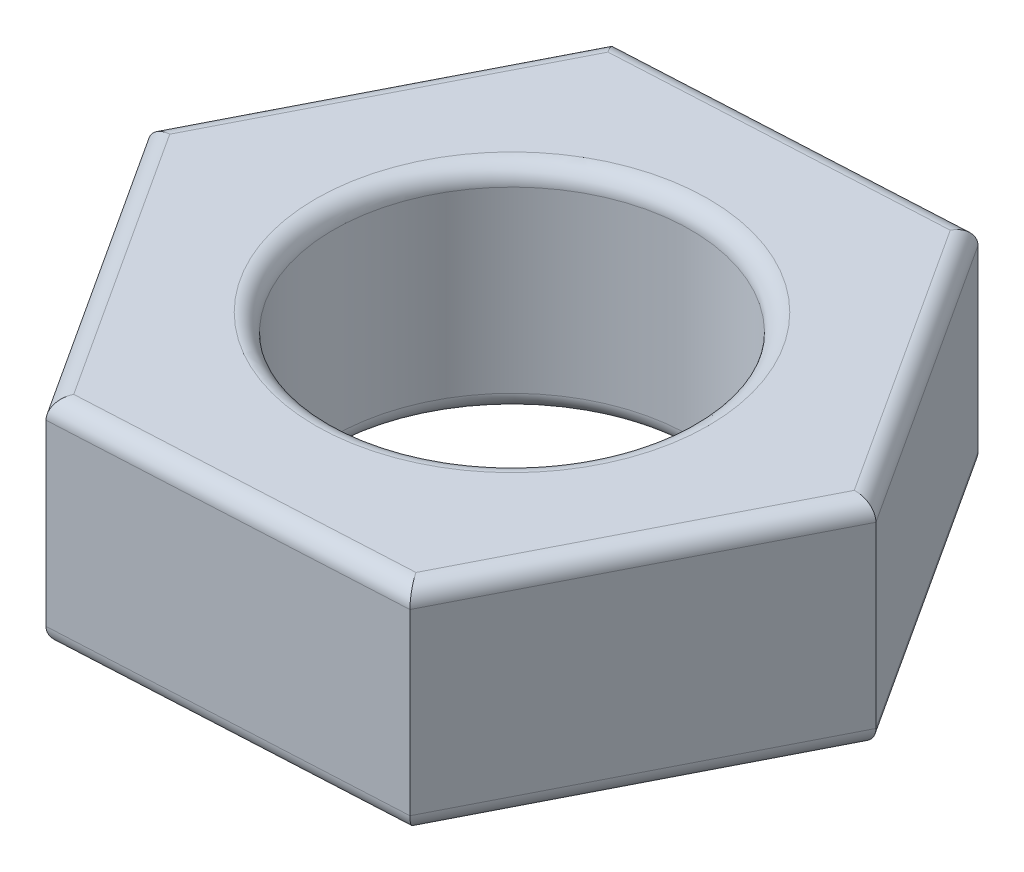
ISO-10303-21;
HEADER;
FILE_DESCRIPTION(('STEP AP214'),'2;1');
FILE_NAME('part.step','',(''),(''),'','','');
FILE_SCHEMA(('AUTOMOTIVE_DESIGN { 1 0 10303 214 1 1 1 1 }'));
ENDSEC;
DATA;
#1=APPLICATION_CONTEXT('core data for automotive mechanical design processes');
#2=APPLICATION_PROTOCOL_DEFINITION('international standard','automotive_design',2000,#1);
#3=PRODUCT_CONTEXT('',#1,'mechanical');
#4=PRODUCT('Part','Part','',(#3));
#5=PRODUCT_RELATED_PRODUCT_CATEGORY('part','',(#4));
#6=PRODUCT_DEFINITION_FORMATION('','',#4);
#7=PRODUCT_DEFINITION_CONTEXT('part definition',#1,'design');
#8=PRODUCT_DEFINITION('design','',#6,#7);
#9=PRODUCT_DEFINITION_SHAPE('','',#8);
#10=(LENGTH_UNIT() NAMED_UNIT(*) SI_UNIT(.MILLI.,.METRE.));
#11=(NAMED_UNIT(*) PLANE_ANGLE_UNIT() SI_UNIT($,.RADIAN.));
#12=(NAMED_UNIT(*) SI_UNIT($,.STERADIAN.) SOLID_ANGLE_UNIT());
#13=UNCERTAINTY_MEASURE_WITH_UNIT(LENGTH_MEASURE(1.E-05),#10,'distance_accuracy_value','');
#14=(GEOMETRIC_REPRESENTATION_CONTEXT(3) GLOBAL_UNCERTAINTY_ASSIGNED_CONTEXT((#13)) GLOBAL_UNIT_ASSIGNED_CONTEXT((#10,
#11,#12)) REPRESENTATION_CONTEXT('',''));
#15=CARTESIAN_POINT('',(0.,0.,0.));
#16=DIRECTION('',(0.,0.,1.));
#17=DIRECTION('',(1.,0.,0.));
#18=AXIS2_PLACEMENT_3D('',#15,#16,#17);
#19=CARTESIAN_POINT('',(0.,6.,0.));
#20=DIRECTION('',(0.,1.,0.));
#21=DIRECTION('',(0.,0.,1.));
#22=AXIS2_PLACEMENT_3D('',#19,#20,#21);
#23=PLANE('',#22);
#24=CARTESIAN_POINT('',(0.,6.,0.));
#25=DIRECTION('',(0.,1.,0.));
#26=DIRECTION('',(0.,0.,1.));
#27=AXIS2_PLACEMENT_3D('',#24,#25,#26);
#28=CIRCLE('',#27,5.5);
#29=CARTESIAN_POINT('',(0.,6.,5.5));
#30=VERTEX_POINT('',#29);
#31=EDGE_CURVE('E11',#30,#30,#28,.F.);
#32=ORIENTED_EDGE('',*,*,#31,.T.);
#33=EDGE_LOOP('',(#32));
#34=FACE_BOUND('',#33,.T.);
#35=DIRECTION('',(-0.45436537546848,0.,0.890815416107842));
#36=VECTOR('',#35,1.);
#37=CARTESIAN_POINT('',(-9.2409967506842,6.,0.730738704219309));
#38=LINE('',#37,#36);
#39=CARTESIAN_POINT('',(-4.96505080973829,6.,-7.65255537647723));
#40=VERTEX_POINT('',#39);
#41=CARTESIAN_POINT('',(-9.10983276476561,6.,0.473582444075242));
#42=VERTEX_POINT('',#41);
#43=EDGE_CURVE('E53',#40,#42,#38,.T.);
#44=ORIENTED_EDGE('',*,*,#43,.T.);
#45=DIRECTION('',(0.544286092697957,0.,0.838899665809679));
#46=VECTOR('',#45,1.);
#47=CARTESIAN_POINT('',(-3.98766009395965,6.,8.36830729449163));
#48=LINE('',#47,#46);
#49=CARTESIAN_POINT('',(-4.14478195502732,6.,8.12613782055248));
#50=VERTEX_POINT('',#49);
#51=EDGE_CURVE('E45',#42,#50,#48,.T.);
#52=ORIENTED_EDGE('',*,*,#51,.T.);
#53=DIRECTION('',(0.998651468166436,0.,-0.0519157502981627));
#54=VECTOR('',#53,1.);
#55=CARTESIAN_POINT('',(5.25333665672455,6.,7.63756859027232));
#56=LINE('',#55,#54);
#57=CARTESIAN_POINT('',(4.96505080973829,6.,7.65255537647723));
#58=VERTEX_POINT('',#57);
#59=EDGE_CURVE('E197',#50,#58,#56,.T.);
#60=ORIENTED_EDGE('',*,*,#59,.T.);
#61=DIRECTION('',(0.45436537546848,0.,-0.890815416107842));
#62=VECTOR('',#61,1.);
#63=CARTESIAN_POINT('',(9.2409967506842,6.,-0.730738704219312));
#64=LINE('',#63,#62);
#65=CARTESIAN_POINT('',(9.10983276476562,6.,-0.473582444075246));
#66=VERTEX_POINT('',#65);
#67=EDGE_CURVE('E199',#58,#66,#64,.T.);
#68=ORIENTED_EDGE('',*,*,#67,.T.);
#69=DIRECTION('',(-0.544286092697956,0.,-0.838899665809679));
#70=VECTOR('',#69,1.);
#71=CARTESIAN_POINT('',(3.98766009395966,6.,-8.36830729449163));
#72=LINE('',#71,#70);
#73=CARTESIAN_POINT('',(4.14478195502733,6.,-8.12613782055247));
#74=VERTEX_POINT('',#73);
#75=EDGE_CURVE('E201',#66,#74,#72,.T.);
#76=ORIENTED_EDGE('',*,*,#75,.T.);
#77=DIRECTION('',(-0.998651468166436,0.,0.0519157502981625));
#78=VECTOR('',#77,1.);
#79=CARTESIAN_POINT('',(-5.25333665672454,6.,-7.63756859027232));
#80=LINE('',#79,#78);
#81=EDGE_CURVE('E58',#74,#40,#80,.T.);
#82=ORIENTED_EDGE('',*,*,#81,.T.);
#83=EDGE_LOOP('',(#44,#52,#60,#68,#76,#82));
#84=FACE_BOUND('',#83,.T.);
#85=ADVANCED_FACE('F36',(#34,#84),#23,.T.);
#86=CARTESIAN_POINT('',(0.,0.,0.));
#87=DIRECTION('',(0.,1.,0.));
#88=DIRECTION('',(0.,0.,1.));
#89=AXIS2_PLACEMENT_3D('',#86,#87,#88);
#90=PLANE('',#89);
#91=CARTESIAN_POINT('',(0.,0.,0.));
#92=DIRECTION('',(0.,1.,0.));
#93=DIRECTION('',(0.,0.,1.));
#94=AXIS2_PLACEMENT_3D('',#91,#92,#93);
#95=CIRCLE('',#94,5.5);
#96=CARTESIAN_POINT('',(0.,0.,5.5));
#97=VERTEX_POINT('',#96);
#98=EDGE_CURVE('E154',#97,#97,#95,.T.);
#99=ORIENTED_EDGE('',*,*,#98,.T.);
#100=EDGE_LOOP('',(#99));
#101=FACE_BOUND('',#100,.T.);
#102=DIRECTION('',(-0.544286092697956,0.,-0.838899665809679));
#103=VECTOR('',#102,1.);
#104=CARTESIAN_POINT('',(6.62730735989647,0.,-4.29986013231386));
#105=LINE('',#104,#103);
#106=CARTESIAN_POINT('',(4.14478195502733,0.,-8.12613782055247));
#107=VERTEX_POINT('',#106);
#108=CARTESIAN_POINT('',(9.10983276476562,0.,-0.473582444075246));
#109=VERTEX_POINT('',#108);
#110=EDGE_CURVE('E153',#107,#109,#105,.F.);
#111=ORIENTED_EDGE('',*,*,#110,.T.);
#112=DIRECTION('',(0.45436537546848,0.,-0.890815416107842));
#113=VECTOR('',#112,1.);
#114=CARTESIAN_POINT('',(7.03744178725195,0.,3.58948646620099));
#115=LINE('',#114,#113);
#116=CARTESIAN_POINT('',(4.96505080973829,0.,7.65255537647723));
#117=VERTEX_POINT('',#116);
#118=EDGE_CURVE('E132',#109,#117,#115,.F.);
#119=ORIENTED_EDGE('',*,*,#118,.T.);
#120=DIRECTION('',(0.998651468166436,0.,-0.0519157502981627));
#121=VECTOR('',#120,1.);
#122=CARTESIAN_POINT('',(0.410134427355486,0.,7.88934659851485));
#123=LINE('',#122,#121);
#124=CARTESIAN_POINT('',(-4.14478195502732,0.,8.12613782055248));
#125=VERTEX_POINT('',#124);
#126=EDGE_CURVE('E142',#117,#125,#123,.F.);
#127=ORIENTED_EDGE('',*,*,#126,.T.);
#128=DIRECTION('',(0.544286092697957,0.,0.838899665809679));
#129=VECTOR('',#128,1.);
#130=CARTESIAN_POINT('',(-6.62730735989647,0.,4.29986013231386));
#131=LINE('',#130,#129);
#132=CARTESIAN_POINT('',(-9.10983276476561,0.,0.473582444075244));
#133=VERTEX_POINT('',#132);
#134=EDGE_CURVE('E148',#125,#133,#131,.F.);
#135=ORIENTED_EDGE('',*,*,#134,.T.);
#136=DIRECTION('',(-0.45436537546848,0.,0.890815416107842));
#137=VECTOR('',#136,1.);
#138=CARTESIAN_POINT('',(-7.03744178725195,0.,-3.58948646620099));
#139=LINE('',#138,#137);
#140=CARTESIAN_POINT('',(-4.96505080973829,0.,-7.65255537647723));
#141=VERTEX_POINT('',#140);
#142=EDGE_CURVE('E262',#133,#141,#139,.F.);
#143=ORIENTED_EDGE('',*,*,#142,.T.);
#144=DIRECTION('',(-0.998651468166436,0.,0.0519157502981625));
#145=VECTOR('',#144,1.);
#146=CARTESIAN_POINT('',(-0.410134427355484,0.,-7.88934659851485));
#147=LINE('',#146,#145);
#148=EDGE_CURVE('E159',#141,#107,#147,.F.);
#149=ORIENTED_EDGE('',*,*,#148,.T.);
#150=EDGE_LOOP('',(#111,#119,#127,#135,#143,#149));
#151=FACE_BOUND('',#150,.T.);
#152=ADVANCED_FACE('F151',(#101,#151),#90,.F.);
#153=CARTESIAN_POINT('',(-4.40710992686449,6.,8.64045034084061));
#154=DIRECTION('',(-0.0519157502981627,0.,-0.998651468166436));
#155=DIRECTION('',(-0.998651468166436,0.,0.0519157502981627));
#156=AXIS2_PLACEMENT_3D('',#153,#154,#155);
#157=PLANE('',#156);
#158=DIRECTION('',(0.,-1.,0.));
#159=VECTOR('',#158,1.);
#160=CARTESIAN_POINT('',(-4.40710992686449,6.,8.64045034084061));
#161=LINE('',#160,#159);
#162=CARTESIAN_POINT('',(-4.40710992686449,5.5,8.64045034084061));
#163=VERTEX_POINT('',#162);
#164=CARTESIAN_POINT('',(-4.40710992686449,0.5,8.64045034084061));
#165=VERTEX_POINT('',#164);
#166=EDGE_CURVE('E218',#163,#165,#161,.T.);
#167=ORIENTED_EDGE('',*,*,#166,.T.);
#168=DIRECTION('',(0.998651468166436,0.,-0.0519157502981627));
#169=VECTOR('',#168,1.);
#170=CARTESIAN_POINT('',(-4.40710992686449,0.5,8.64045034084061));
#171=LINE('',#170,#169);
#172=CARTESIAN_POINT('',(5.27929453187363,0.5,8.13689432435554));
#173=VERTEX_POINT('',#172);
#174=EDGE_CURVE('E195',#165,#173,#171,.T.);
#175=ORIENTED_EDGE('',*,*,#174,.T.);
#176=DIRECTION('',(0.,-1.,0.));
#177=VECTOR('',#176,1.);
#178=CARTESIAN_POINT('',(5.27929453187363,6.,8.13689432435554));
#179=LINE('',#178,#177);
#180=CARTESIAN_POINT('',(5.27929453187363,5.5,8.13689432435554));
#181=VERTEX_POINT('',#180);
#182=EDGE_CURVE('E149',#181,#173,#179,.T.);
#183=ORIENTED_EDGE('',*,*,#182,.F.);
#184=DIRECTION('',(0.998651468166436,0.,-0.0519157502981627));
#185=VECTOR('',#184,1.);
#186=CARTESIAN_POINT('',(-4.40710992686449,5.5,8.64045034084061));
#187=LINE('',#186,#185);
#188=EDGE_CURVE('E193',#181,#163,#187,.F.);
#189=ORIENTED_EDGE('',*,*,#188,.T.);
#190=EDGE_LOOP('',(#167,#175,#183,#189));
#191=FACE_BOUND('',#190,.T.);
#192=ADVANCED_FACE('F286',(#191),#157,.F.);
#193=CARTESIAN_POINT('',(5.27929453187363,6.,8.13689432435554));
#194=DIRECTION('',(-0.890815416107842,0.,-0.45436537546848));
#195=DIRECTION('',(-0.45436537546848,0.,0.890815416107842));
#196=AXIS2_PLACEMENT_3D('',#193,#194,#195);
#197=PLANE('',#196);
#198=ORIENTED_EDGE('',*,*,#182,.T.);
#199=DIRECTION('',(0.45436537546848,0.,-0.890815416107842));
#200=VECTOR('',#199,1.);
#201=CARTESIAN_POINT('',(5.27929453187363,0.5,8.13689432435554));
#202=LINE('',#201,#200);
#203=CARTESIAN_POINT('',(9.68640445873812,0.5,-0.503556016485071));
#204=VERTEX_POINT('',#203);
#205=EDGE_CURVE('E135',#173,#204,#202,.T.);
#206=ORIENTED_EDGE('',*,*,#205,.T.);
#207=DIRECTION('',(0.,-1.,0.));
#208=VECTOR('',#207,1.);
#209=CARTESIAN_POINT('',(9.68640445873812,6.,-0.503556016485071));
#210=LINE('',#209,#208);
#211=CARTESIAN_POINT('',(9.68640445873812,5.5,-0.503556016485071));
#212=VERTEX_POINT('',#211);
#213=EDGE_CURVE('E247',#212,#204,#210,.T.);
#214=ORIENTED_EDGE('',*,*,#213,.F.);
#215=DIRECTION('',(0.45436537546848,0.,-0.890815416107842));
#216=VECTOR('',#215,1.);
#217=CARTESIAN_POINT('',(5.27929453187363,5.5,8.13689432435554));
#218=LINE('',#217,#216);
#219=EDGE_CURVE('E168',#212,#181,#218,.F.);
#220=ORIENTED_EDGE('',*,*,#219,.T.);
#221=EDGE_LOOP('',(#198,#206,#214,#220));
#222=FACE_BOUND('',#221,.T.);
#223=ADVANCED_FACE('F252',(#222),#197,.F.);
#224=CARTESIAN_POINT('',(9.68640445873812,6.,-0.503556016485071));
#225=DIRECTION('',(-0.838899665809679,0.,0.544286092697956));
#226=DIRECTION('',(0.544286092697956,0.,0.838899665809679));
#227=AXIS2_PLACEMENT_3D('',#224,#225,#226);
#228=PLANE('',#227);
#229=ORIENTED_EDGE('',*,*,#213,.T.);
#230=DIRECTION('',(-0.544286092697956,0.,-0.838899665809679));
#231=VECTOR('',#230,1.);
#232=CARTESIAN_POINT('',(9.68640445873812,0.5,-0.503556016485071));
#233=LINE('',#232,#231);
#234=CARTESIAN_POINT('',(4.4071099268645,0.5,-8.64045034084061));
#235=VERTEX_POINT('',#234);
#236=EDGE_CURVE('E175',#204,#235,#233,.T.);
#237=ORIENTED_EDGE('',*,*,#236,.T.);
#238=DIRECTION('',(0.,-1.,0.));
#239=VECTOR('',#238,1.);
#240=CARTESIAN_POINT('',(4.4071099268645,6.,-8.64045034084061));
#241=LINE('',#240,#239);
#242=CARTESIAN_POINT('',(4.4071099268645,5.5,-8.64045034084061));
#243=VERTEX_POINT('',#242);
#244=EDGE_CURVE('E249',#243,#235,#241,.T.);
#245=ORIENTED_EDGE('',*,*,#244,.F.);
#246=DIRECTION('',(-0.544286092697956,0.,-0.838899665809679));
#247=VECTOR('',#246,1.);
#248=CARTESIAN_POINT('',(9.68640445873812,5.5,-0.503556016485071));
#249=LINE('',#248,#247);
#250=EDGE_CURVE('E172',#243,#212,#249,.F.);
#251=ORIENTED_EDGE('',*,*,#250,.T.);
#252=EDGE_LOOP('',(#229,#237,#245,#251));
#253=FACE_BOUND('',#252,.T.);
#254=ADVANCED_FACE('F246',(#253),#228,.F.);
#255=CARTESIAN_POINT('',(4.4071099268645,6.,-8.64045034084061));
#256=DIRECTION('',(0.0519157502981625,0.,0.998651468166436));
#257=DIRECTION('',(0.998651468166436,0.,-0.0519157502981625));
#258=AXIS2_PLACEMENT_3D('',#255,#256,#257);
#259=PLANE('',#258);
#260=ORIENTED_EDGE('',*,*,#244,.T.);
#261=DIRECTION('',(-0.998651468166436,0.,0.0519157502981625));
#262=VECTOR('',#261,1.);
#263=CARTESIAN_POINT('',(4.4071099268645,0.5,-8.64045034084061));
#264=LINE('',#263,#262);
#265=CARTESIAN_POINT('',(-5.27929453187363,0.5,-8.13689432435554));
#266=VERTEX_POINT('',#265);
#267=EDGE_CURVE('E179',#235,#266,#264,.T.);
#268=ORIENTED_EDGE('',*,*,#267,.T.);
#269=DIRECTION('',(0.,-1.,0.));
#270=VECTOR('',#269,1.);
#271=CARTESIAN_POINT('',(-5.27929453187363,6.,-8.13689432435554));
#272=LINE('',#271,#270);
#273=CARTESIAN_POINT('',(-5.27929453187363,5.5,-8.13689432435554));
#274=VERTEX_POINT('',#273);
#275=EDGE_CURVE('E256',#274,#266,#272,.T.);
#276=ORIENTED_EDGE('',*,*,#275,.F.);
#277=DIRECTION('',(-0.998651468166436,0.,0.0519157502981625));
#278=VECTOR('',#277,1.);
#279=CARTESIAN_POINT('',(4.4071099268645,5.5,-8.64045034084061));
#280=LINE('',#279,#278);
#281=EDGE_CURVE('E177',#274,#243,#280,.F.);
#282=ORIENTED_EDGE('',*,*,#281,.T.);
#283=EDGE_LOOP('',(#260,#268,#276,#282));
#284=FACE_BOUND('',#283,.T.);
#285=ADVANCED_FACE('F274',(#284),#259,.F.);
#286=CARTESIAN_POINT('',(-5.27929453187363,6.,-8.13689432435554));
#287=DIRECTION('',(0.890815416107842,0.,0.45436537546848));
#288=DIRECTION('',(0.45436537546848,0.,-0.890815416107842));
#289=AXIS2_PLACEMENT_3D('',#286,#287,#288);
#290=PLANE('',#289);
#291=ORIENTED_EDGE('',*,*,#275,.T.);
#292=DIRECTION('',(-0.45436537546848,0.,0.890815416107842));
#293=VECTOR('',#292,1.);
#294=CARTESIAN_POINT('',(-5.27929453187363,0.5,-8.13689432435554));
#295=LINE('',#294,#293);
#296=CARTESIAN_POINT('',(-9.68640445873812,0.5,0.503556016485069));
#297=VERTEX_POINT('',#296);
#298=EDGE_CURVE('E184',#266,#297,#295,.T.);
#299=ORIENTED_EDGE('',*,*,#298,.T.);
#300=DIRECTION('',(0.,-1.,0.));
#301=VECTOR('',#300,1.);
#302=CARTESIAN_POINT('',(-9.68640445873812,6.,0.503556016485069));
#303=LINE('',#302,#301);
#304=CARTESIAN_POINT('',(-9.68640445873812,5.5,0.503556016485069));
#305=VERTEX_POINT('',#304);
#306=EDGE_CURVE('E279',#305,#297,#303,.T.);
#307=ORIENTED_EDGE('',*,*,#306,.F.);
#308=DIRECTION('',(-0.45436537546848,0.,0.890815416107842));
#309=VECTOR('',#308,1.);
#310=CARTESIAN_POINT('',(-5.27929453187363,5.5,-8.13689432435554));
#311=LINE('',#310,#309);
#312=EDGE_CURVE('E181',#305,#274,#311,.F.);
#313=ORIENTED_EDGE('',*,*,#312,.T.);
#314=EDGE_LOOP('',(#291,#299,#307,#313));
#315=FACE_BOUND('',#314,.T.);
#316=ADVANCED_FACE('F297',(#315),#290,.F.);
#317=CARTESIAN_POINT('',(-9.68640445873812,6.,0.503556016485069));
#318=DIRECTION('',(0.838899665809679,0.,-0.544286092697956));
#319=DIRECTION('',(-0.544286092697957,0.,-0.838899665809679));
#320=AXIS2_PLACEMENT_3D('',#317,#318,#319);
#321=PLANE('',#320);
#322=ORIENTED_EDGE('',*,*,#306,.T.);
#323=DIRECTION('',(0.544286092697957,0.,0.838899665809679));
#324=VECTOR('',#323,1.);
#325=CARTESIAN_POINT('',(-9.68640445873812,0.5,0.503556016485069));
#326=LINE('',#325,#324);
#327=EDGE_CURVE('E190',#297,#165,#326,.T.);
#328=ORIENTED_EDGE('',*,*,#327,.T.);
#329=ORIENTED_EDGE('',*,*,#166,.F.);
#330=DIRECTION('',(0.544286092697957,0.,0.838899665809679));
#331=VECTOR('',#330,1.);
#332=CARTESIAN_POINT('',(-9.68640445873812,5.5,0.503556016485069));
#333=LINE('',#332,#331);
#334=EDGE_CURVE('E186',#163,#305,#333,.F.);
#335=ORIENTED_EDGE('',*,*,#334,.T.);
#336=EDGE_LOOP('',(#322,#328,#329,#335));
#337=FACE_BOUND('',#336,.T.);
#338=ADVANCED_FACE('F298',(#337),#321,.F.);
#339=CARTESIAN_POINT('',(0.,6.,0.));
#340=DIRECTION('',(0.,-1.,0.));
#341=DIRECTION('',(0.,0.,-1.));
#342=AXIS2_PLACEMENT_3D('',#339,#340,#341);
#343=CYLINDRICAL_SURFACE('',#342,5.);
#344=CARTESIAN_POINT('',(0.,0.5,0.));
#345=DIRECTION('',(0.,1.,0.));
#346=DIRECTION('',(0.,0.,1.));
#347=AXIS2_PLACEMENT_3D('',#344,#345,#346);
#348=CIRCLE('',#347,5.);
#349=CARTESIAN_POINT('',(0.,0.5,5.));
#350=VERTEX_POINT('',#349);
#351=EDGE_CURVE('E165',#350,#350,#348,.F.);
#352=ORIENTED_EDGE('',*,*,#351,.T.);
#353=EDGE_LOOP('',(#352));
#354=FACE_BOUND('',#353,.T.);
#355=CARTESIAN_POINT('',(0.,5.5,0.));
#356=DIRECTION('',(0.,1.,0.));
#357=DIRECTION('',(0.,0.,1.));
#358=AXIS2_PLACEMENT_3D('',#355,#356,#357);
#359=CIRCLE('',#358,5.);
#360=CARTESIAN_POINT('',(0.,5.5,5.));
#361=VERTEX_POINT('',#360);
#362=EDGE_CURVE('E157',#361,#361,#359,.T.);
#363=ORIENTED_EDGE('',*,*,#362,.T.);
#364=EDGE_LOOP('',(#363));
#365=FACE_BOUND('',#364,.T.);
#366=ADVANCED_FACE('F317',(#354,#365),#343,.F.);
#367=CARTESIAN_POINT('',(0.,0.5,0.));
#368=DIRECTION('',(0.,1.,0.));
#369=DIRECTION('',(0.,0.,1.));
#370=AXIS2_PLACEMENT_3D('',#367,#368,#369);
#371=TOROIDAL_SURFACE('',#370,5.5,0.5);
#372=ORIENTED_EDGE('',*,*,#351,.F.);
#373=EDGE_LOOP('',(#372));
#374=FACE_BOUND('',#373,.T.);
#375=ORIENTED_EDGE('',*,*,#98,.F.);
#376=EDGE_LOOP('',(#375));
#377=FACE_BOUND('',#376,.T.);
#378=ADVANCED_FACE('F331',(#374,#377),#371,.T.);
#379=CARTESIAN_POINT('',(-4.8338868238197,0.5,-7.9097116366213));
#380=DIRECTION('',(-0.45436537546848,0.,0.890815416107842));
#381=DIRECTION('',(0.890815416107842,0.,0.45436537546848));
#382=AXIS2_PLACEMENT_3D('',#379,#380,#381);
#383=CYLINDRICAL_SURFACE('',#382,0.5);
#384=CARTESIAN_POINT('',(-4.96505080973829,0.5,-7.65255537647723));
#385=DIRECTION('',(-0.838899665809679,0.,0.544286092697957));
#386=DIRECTION('',(0.544286092697957,0.,0.838899665809679));
#387=AXIS2_PLACEMENT_3D('',#384,#385,#386);
#388=ELLIPSE('',#387,0.577350269189626,0.5);
#389=EDGE_CURVE('E212',#141,#266,#388,.F.);
#390=ORIENTED_EDGE('',*,*,#389,.F.);
#391=ORIENTED_EDGE('',*,*,#142,.F.);
#392=CARTESIAN_POINT('',(-9.10983276476561,0.5,0.473582444075246));
#393=DIRECTION('',(0.0519157502981626,0.,0.998651468166436));
#394=DIRECTION('',(0.998651468166436,0.,-0.0519157502981628));
#395=AXIS2_PLACEMENT_3D('',#392,#393,#394);
#396=ELLIPSE('',#395,0.577350269189626,0.5);
#397=EDGE_CURVE('E215',#297,#133,#396,.T.);
#398=ORIENTED_EDGE('',*,*,#397,.F.);
#399=ORIENTED_EDGE('',*,*,#298,.F.);
#400=EDGE_LOOP('',(#390,#391,#398,#399));
#401=FACE_BOUND('',#400,.T.);
#402=ADVANCED_FACE('F295',(#401),#383,.T.);
#403=CARTESIAN_POINT('',(-9.26695462583328,0.5,0.231412970136091));
#404=DIRECTION('',(0.544286092697957,0.,0.838899665809679));
#405=DIRECTION('',(0.838899665809679,0.,-0.544286092697957));
#406=AXIS2_PLACEMENT_3D('',#403,#404,#405);
#407=CYLINDRICAL_SURFACE('',#406,0.5);
#408=ORIENTED_EDGE('',*,*,#397,.T.);
#409=ORIENTED_EDGE('',*,*,#134,.F.);
#410=CARTESIAN_POINT('',(-4.14478195502732,0.5,8.12613782055248));
#411=DIRECTION('',(0.890815416107842,0.,0.45436537546848));
#412=DIRECTION('',(0.45436537546848,0.,-0.890815416107842));
#413=AXIS2_PLACEMENT_3D('',#410,#411,#412);
#414=ELLIPSE('',#413,0.577350269189626,0.5);
#415=EDGE_CURVE('E145',#165,#125,#414,.T.);
#416=ORIENTED_EDGE('',*,*,#415,.F.);
#417=ORIENTED_EDGE('',*,*,#327,.F.);
#418=EDGE_LOOP('',(#408,#409,#416,#417));
#419=FACE_BOUND('',#418,.T.);
#420=ADVANCED_FACE('F292',(#419),#407,.T.);
#421=CARTESIAN_POINT('',(4.43306780201358,0.5,-8.14112460675739));
#422=DIRECTION('',(-0.998651468166436,0.,0.0519157502981625));
#423=DIRECTION('',(0.0519157502981625,0.,0.998651468166436));
#424=AXIS2_PLACEMENT_3D('',#421,#422,#423);
#425=CYLINDRICAL_SURFACE('',#424,0.5);
#426=ORIENTED_EDGE('',*,*,#389,.T.);
#427=ORIENTED_EDGE('',*,*,#267,.F.);
#428=CARTESIAN_POINT('',(4.14478195502733,0.5,-8.12613782055248));
#429=DIRECTION('',(-0.890815416107842,0.,-0.45436537546848));
#430=DIRECTION('',(-0.45436537546848,0.,0.890815416107842));
#431=AXIS2_PLACEMENT_3D('',#428,#429,#430);
#432=ELLIPSE('',#431,0.577350269189626,0.5);
#433=EDGE_CURVE('E138',#107,#235,#432,.F.);
#434=ORIENTED_EDGE('',*,*,#433,.F.);
#435=ORIENTED_EDGE('',*,*,#148,.F.);
#436=EDGE_LOOP('',(#426,#427,#434,#435));
#437=FACE_BOUND('',#436,.T.);
#438=ADVANCED_FACE('F269',(#437),#425,.T.);
#439=CARTESIAN_POINT('',(-4.43306780201357,0.5,8.14112460675739));
#440=DIRECTION('',(0.998651468166436,0.,-0.0519157502981627));
#441=DIRECTION('',(-0.0519157502981627,0.,-0.998651468166436));
#442=AXIS2_PLACEMENT_3D('',#439,#440,#441);
#443=CYLINDRICAL_SURFACE('',#442,0.5);
#444=ORIENTED_EDGE('',*,*,#415,.T.);
#445=ORIENTED_EDGE('',*,*,#126,.F.);
#446=CARTESIAN_POINT('',(4.96505080973829,0.5,7.65255537647723));
#447=DIRECTION('',(0.838899665809679,0.,-0.544286092697957));
#448=DIRECTION('',(0.544286092697957,0.,0.838899665809679));
#449=AXIS2_PLACEMENT_3D('',#446,#447,#448);
#450=ELLIPSE('',#449,0.577350269189626,0.5);
#451=EDGE_CURVE('E128',#173,#117,#450,.T.);
#452=ORIENTED_EDGE('',*,*,#451,.F.);
#453=ORIENTED_EDGE('',*,*,#174,.F.);
#454=EDGE_LOOP('',(#444,#445,#452,#453));
#455=FACE_BOUND('',#454,.T.);
#456=ADVANCED_FACE('F143',(#455),#443,.T.);
#457=CARTESIAN_POINT('',(9.26695462583328,0.5,-0.231412970136093));
#458=DIRECTION('',(-0.544286092697956,0.,-0.838899665809679));
#459=DIRECTION('',(-0.838899665809679,0.,0.544286092697956));
#460=AXIS2_PLACEMENT_3D('',#457,#458,#459);
#461=CYLINDRICAL_SURFACE('',#460,0.5);
#462=ORIENTED_EDGE('',*,*,#433,.T.);
#463=ORIENTED_EDGE('',*,*,#236,.F.);
#464=CARTESIAN_POINT('',(9.10983276476562,0.5,-0.473582444075248));
#465=DIRECTION('',(-0.0519157502981625,0.,-0.998651468166436));
#466=DIRECTION('',(-0.998651468166436,0.,0.0519157502981627));
#467=AXIS2_PLACEMENT_3D('',#464,#465,#466);
#468=ELLIPSE('',#467,0.577350269189626,0.5);
#469=EDGE_CURVE('E139',#109,#204,#468,.F.);
#470=ORIENTED_EDGE('',*,*,#469,.F.);
#471=ORIENTED_EDGE('',*,*,#110,.F.);
#472=EDGE_LOOP('',(#462,#463,#470,#471));
#473=FACE_BOUND('',#472,.T.);
#474=ADVANCED_FACE('F272',(#473),#461,.T.);
#475=CARTESIAN_POINT('',(4.83388682381971,0.5,7.9097116366213));
#476=DIRECTION('',(0.45436537546848,0.,-0.890815416107842));
#477=DIRECTION('',(-0.890815416107842,0.,-0.45436537546848));
#478=AXIS2_PLACEMENT_3D('',#475,#476,#477);
#479=CYLINDRICAL_SURFACE('',#478,0.5);
#480=ORIENTED_EDGE('',*,*,#451,.T.);
#481=ORIENTED_EDGE('',*,*,#118,.F.);
#482=ORIENTED_EDGE('',*,*,#469,.T.);
#483=ORIENTED_EDGE('',*,*,#205,.F.);
#484=EDGE_LOOP('',(#480,#481,#482,#483));
#485=FACE_BOUND('',#484,.T.);
#486=ADVANCED_FACE('F130',(#485),#479,.T.);
#487=CARTESIAN_POINT('',(0.,5.5,0.));
#488=DIRECTION('',(0.,1.,0.));
#489=DIRECTION('',(0.,0.,1.));
#490=AXIS2_PLACEMENT_3D('',#487,#488,#489);
#491=TOROIDAL_SURFACE('',#490,5.5,0.5);
#492=ORIENTED_EDGE('',*,*,#31,.F.);
#493=EDGE_LOOP('',(#492));
#494=FACE_BOUND('',#493,.T.);
#495=ORIENTED_EDGE('',*,*,#362,.F.);
#496=EDGE_LOOP('',(#495));
#497=FACE_BOUND('',#496,.T.);
#498=ADVANCED_FACE('F337',(#494,#497),#491,.T.);
#499=CARTESIAN_POINT('',(6.62730735989647,5.5,-4.29986013231386));
#500=DIRECTION('',(0.544286092697956,0.,0.838899665809679));
#501=DIRECTION('',(0.838899665809679,0.,-0.544286092697956));
#502=AXIS2_PLACEMENT_3D('',#499,#500,#501);
#503=CYLINDRICAL_SURFACE('',#502,0.5);
#504=CARTESIAN_POINT('',(9.10983276476562,5.5,-0.473582444075246));
#505=DIRECTION('',(0.0519157502981625,0.,0.998651468166436));
#506=DIRECTION('',(-0.998651468166436,0.,0.0519157502981627));
#507=AXIS2_PLACEMENT_3D('',#504,#505,#506);
#508=ELLIPSE('',#507,0.577350269189626,0.5);
#509=EDGE_CURVE('E228',#212,#66,#508,.T.);
#510=ORIENTED_EDGE('',*,*,#509,.F.);
#511=ORIENTED_EDGE('',*,*,#250,.F.);
#512=CARTESIAN_POINT('',(4.14478195502733,5.5,-8.12613782055247));
#513=DIRECTION('',(0.890815416107842,0.,0.45436537546848));
#514=DIRECTION('',(-0.45436537546848,0.,0.890815416107842));
#515=AXIS2_PLACEMENT_3D('',#512,#513,#514);
#516=ELLIPSE('',#515,0.577350269189626,0.5);
#517=EDGE_CURVE('E40',#74,#243,#516,.F.);
#518=ORIENTED_EDGE('',*,*,#517,.F.);
#519=ORIENTED_EDGE('',*,*,#75,.F.);
#520=EDGE_LOOP('',(#510,#511,#518,#519));
#521=FACE_BOUND('',#520,.T.);
#522=ADVANCED_FACE('F38',(#521),#503,.T.);
#523=CARTESIAN_POINT('',(-0.410134427355484,5.5,-7.88934659851485));
#524=DIRECTION('',(0.998651468166436,0.,-0.0519157502981625));
#525=DIRECTION('',(-0.0519157502981625,0.,-0.998651468166436));
#526=AXIS2_PLACEMENT_3D('',#523,#524,#525);
#527=CYLINDRICAL_SURFACE('',#526,0.5);
#528=ORIENTED_EDGE('',*,*,#517,.T.);
#529=ORIENTED_EDGE('',*,*,#281,.F.);
#530=CARTESIAN_POINT('',(-4.96505080973829,5.5,-7.65255537647723));
#531=DIRECTION('',(0.838899665809679,0.,-0.544286092697957));
#532=DIRECTION('',(0.544286092697957,0.,0.838899665809679));
#533=AXIS2_PLACEMENT_3D('',#530,#531,#532);
#534=ELLIPSE('',#533,0.577350269189626,0.5);
#535=EDGE_CURVE('E226',#40,#274,#534,.F.);
#536=ORIENTED_EDGE('',*,*,#535,.F.);
#537=ORIENTED_EDGE('',*,*,#81,.F.);
#538=EDGE_LOOP('',(#528,#529,#536,#537));
#539=FACE_BOUND('',#538,.T.);
#540=ADVANCED_FACE('F238',(#539),#527,.T.);
#541=CARTESIAN_POINT('',(7.03744178725195,5.5,3.58948646620099));
#542=DIRECTION('',(-0.45436537546848,0.,0.890815416107842));
#543=DIRECTION('',(0.890815416107842,0.,0.45436537546848));
#544=AXIS2_PLACEMENT_3D('',#541,#542,#543);
#545=CYLINDRICAL_SURFACE('',#544,0.5);
#546=ORIENTED_EDGE('',*,*,#509,.T.);
#547=ORIENTED_EDGE('',*,*,#67,.F.);
#548=CARTESIAN_POINT('',(4.96505080973829,5.5,7.65255537647723));
#549=DIRECTION('',(-0.838899665809679,0.,0.544286092697957));
#550=DIRECTION('',(-0.544286092697957,0.,-0.838899665809679));
#551=AXIS2_PLACEMENT_3D('',#548,#549,#550);
#552=ELLIPSE('',#551,0.577350269189626,0.5);
#553=EDGE_CURVE('E223',#181,#58,#552,.T.);
#554=ORIENTED_EDGE('',*,*,#553,.F.);
#555=ORIENTED_EDGE('',*,*,#219,.F.);
#556=EDGE_LOOP('',(#546,#547,#554,#555));
#557=FACE_BOUND('',#556,.T.);
#558=ADVANCED_FACE('F358',(#557),#545,.T.);
#559=CARTESIAN_POINT('',(-7.03744178725195,5.5,-3.58948646620099));
#560=DIRECTION('',(0.45436537546848,0.,-0.890815416107842));
#561=DIRECTION('',(-0.890815416107842,0.,-0.45436537546848));
#562=AXIS2_PLACEMENT_3D('',#559,#560,#561);
#563=CYLINDRICAL_SURFACE('',#562,0.5);
#564=ORIENTED_EDGE('',*,*,#535,.T.);
#565=ORIENTED_EDGE('',*,*,#312,.F.);
#566=CARTESIAN_POINT('',(-9.10983276476561,5.5,0.473582444075241));
#567=DIRECTION('',(-0.0519157502981626,0.,-0.998651468166436));
#568=DIRECTION('',(0.998651468166436,0.,-0.0519157502981628));
#569=AXIS2_PLACEMENT_3D('',#566,#567,#568);
#570=ELLIPSE('',#569,0.577350269189626,0.5);
#571=EDGE_CURVE('E221',#42,#305,#570,.F.);
#572=ORIENTED_EDGE('',*,*,#571,.F.);
#573=ORIENTED_EDGE('',*,*,#43,.F.);
#574=EDGE_LOOP('',(#564,#565,#572,#573));
#575=FACE_BOUND('',#574,.T.);
#576=ADVANCED_FACE('F355',(#575),#563,.T.);
#577=CARTESIAN_POINT('',(0.410134427355486,5.5,7.88934659851485));
#578=DIRECTION('',(-0.998651468166436,0.,0.0519157502981627));
#579=DIRECTION('',(0.0519157502981627,0.,0.998651468166436));
#580=AXIS2_PLACEMENT_3D('',#577,#578,#579);
#581=CYLINDRICAL_SURFACE('',#580,0.5);
#582=ORIENTED_EDGE('',*,*,#553,.T.);
#583=ORIENTED_EDGE('',*,*,#59,.F.);
#584=CARTESIAN_POINT('',(-4.14478195502732,5.5,8.12613782055248));
#585=DIRECTION('',(-0.890815416107842,0.,-0.45436537546848));
#586=DIRECTION('',(-0.45436537546848,0.,0.890815416107842));
#587=AXIS2_PLACEMENT_3D('',#584,#585,#586);
#588=ELLIPSE('',#587,0.577350269189626,0.5);
#589=EDGE_CURVE('E219',#163,#50,#588,.T.);
#590=ORIENTED_EDGE('',*,*,#589,.F.);
#591=ORIENTED_EDGE('',*,*,#188,.F.);
#592=EDGE_LOOP('',(#582,#583,#590,#591));
#593=FACE_BOUND('',#592,.T.);
#594=ADVANCED_FACE('F306',(#593),#581,.T.);
#595=CARTESIAN_POINT('',(-6.62730735989647,5.5,4.29986013231386));
#596=DIRECTION('',(-0.544286092697957,0.,-0.838899665809679));
#597=DIRECTION('',(-0.838899665809679,0.,0.544286092697957));
#598=AXIS2_PLACEMENT_3D('',#595,#596,#597);
#599=CYLINDRICAL_SURFACE('',#598,0.5);
#600=ORIENTED_EDGE('',*,*,#571,.T.);
#601=ORIENTED_EDGE('',*,*,#334,.F.);
#602=ORIENTED_EDGE('',*,*,#589,.T.);
#603=ORIENTED_EDGE('',*,*,#51,.F.);
#604=EDGE_LOOP('',(#600,#601,#602,#603));
#605=FACE_BOUND('',#604,.T.);
#606=ADVANCED_FACE('F301',(#605),#599,.T.);
#607=CLOSED_SHELL('',(#85,#152,#192,#223,#254,#285,#316,#338,#366,#378,#402,#420,#438,#456,#474,
#486,#498,#522,#540,#558,#576,#594,#606));
#608=MANIFOLD_SOLID_BREP('B2',#607);
#609=ADVANCED_BREP_SHAPE_REPRESENTATION('',(#18,#608),#14);
#610=SHAPE_DEFINITION_REPRESENTATION(#9,#609);
ENDSEC;
END-ISO-10303-21;
